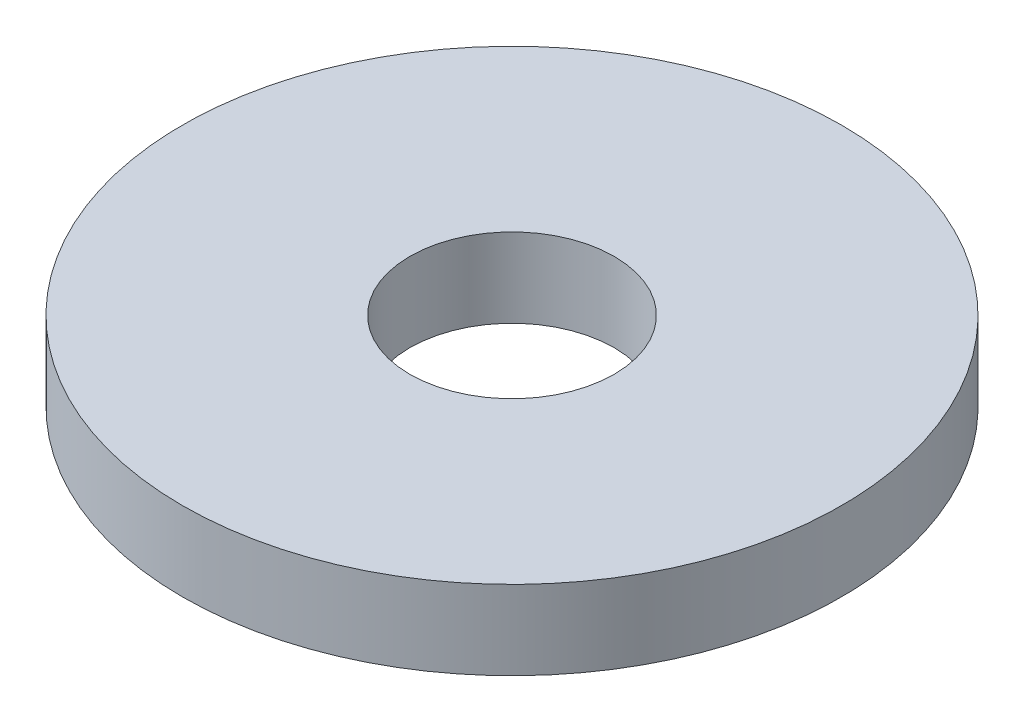
ISO-10303-21;
HEADER;
FILE_DESCRIPTION(('STEP AP214'),'2;1');
FILE_NAME('part.step','',(''),(''),'','','');
FILE_SCHEMA(('AUTOMOTIVE_DESIGN { 1 0 10303 214 1 1 1 1 }'));
ENDSEC;
DATA;
#1=APPLICATION_CONTEXT('core data for automotive mechanical design processes');
#2=APPLICATION_PROTOCOL_DEFINITION('international standard','automotive_design',2000,#1);
#3=PRODUCT_CONTEXT('',#1,'mechanical');
#4=PRODUCT('Part','Part','',(#3));
#5=PRODUCT_RELATED_PRODUCT_CATEGORY('part','',(#4));
#6=PRODUCT_DEFINITION_FORMATION('','',#4);
#7=PRODUCT_DEFINITION_CONTEXT('part definition',#1,'design');
#8=PRODUCT_DEFINITION('design','',#6,#7);
#9=PRODUCT_DEFINITION_SHAPE('','',#8);
#10=(LENGTH_UNIT() NAMED_UNIT(*) SI_UNIT(.MILLI.,.METRE.));
#11=(NAMED_UNIT(*) PLANE_ANGLE_UNIT() SI_UNIT($,.RADIAN.));
#12=(NAMED_UNIT(*) SI_UNIT($,.STERADIAN.) SOLID_ANGLE_UNIT());
#13=UNCERTAINTY_MEASURE_WITH_UNIT(LENGTH_MEASURE(1.E-05),#10,'distance_accuracy_value','');
#14=(GEOMETRIC_REPRESENTATION_CONTEXT(3) GLOBAL_UNCERTAINTY_ASSIGNED_CONTEXT((#13)) GLOBAL_UNIT_ASSIGNED_CONTEXT((#10,
#11,#12)) REPRESENTATION_CONTEXT('',''));
#15=CARTESIAN_POINT('',(0.,0.,0.));
#16=DIRECTION('',(0.,0.,1.));
#17=DIRECTION('',(1.,0.,0.));
#18=AXIS2_PLACEMENT_3D('',#15,#16,#17);
#19=CARTESIAN_POINT('',(0.,1.2,0.));
#20=DIRECTION('',(0.,1.,0.));
#21=DIRECTION('',(0.,0.,1.));
#22=AXIS2_PLACEMENT_3D('',#19,#20,#21);
#23=PLANE('',#22);
#24=CARTESIAN_POINT('',(0.,1.2,0.));
#25=DIRECTION('',(0.,1.,0.));
#26=DIRECTION('',(0.,0.,1.));
#27=AXIS2_PLACEMENT_3D('',#24,#25,#26);
#28=CIRCLE('',#27,5.);
#29=CARTESIAN_POINT('',(0.,1.2,5.));
#30=VERTEX_POINT('',#29);
#31=EDGE_CURVE('E10',#30,#30,#28,.T.);
#32=ORIENTED_EDGE('',*,*,#31,.T.);
#33=EDGE_LOOP('',(#32));
#34=FACE_BOUND('',#33,.T.);
#35=CARTESIAN_POINT('',(0.,1.2,0.));
#36=DIRECTION('',(0.,1.,0.));
#37=DIRECTION('',(0.,0.,1.));
#38=AXIS2_PLACEMENT_3D('',#35,#36,#37);
#39=CIRCLE('',#38,1.55);
#40=CARTESIAN_POINT('',(0.,1.2,1.55));
#41=VERTEX_POINT('',#40);
#42=EDGE_CURVE('E48',#41,#41,#39,.T.);
#43=ORIENTED_EDGE('',*,*,#42,.F.);
#44=EDGE_LOOP('',(#43));
#45=FACE_BOUND('',#44,.T.);
#46=ADVANCED_FACE('F37',(#34,#45),#23,.T.);
#47=CARTESIAN_POINT('',(0.,0.,0.));
#48=DIRECTION('',(0.,1.,0.));
#49=DIRECTION('',(0.,0.,1.));
#50=AXIS2_PLACEMENT_3D('',#47,#48,#49);
#51=PLANE('',#50);
#52=CARTESIAN_POINT('',(0.,0.,0.));
#53=DIRECTION('',(0.,1.,0.));
#54=DIRECTION('',(0.,0.,1.));
#55=AXIS2_PLACEMENT_3D('',#52,#53,#54);
#56=CIRCLE('',#55,5.);
#57=CARTESIAN_POINT('',(0.,0.,5.));
#58=VERTEX_POINT('',#57);
#59=EDGE_CURVE('E41',#58,#58,#56,.T.);
#60=ORIENTED_EDGE('',*,*,#59,.F.);
#61=EDGE_LOOP('',(#60));
#62=FACE_BOUND('',#61,.T.);
#63=CARTESIAN_POINT('',(0.,0.,0.));
#64=DIRECTION('',(0.,1.,0.));
#65=DIRECTION('',(0.,0.,1.));
#66=AXIS2_PLACEMENT_3D('',#63,#64,#65);
#67=CIRCLE('',#66,1.55);
#68=CARTESIAN_POINT('',(0.,0.,1.55));
#69=VERTEX_POINT('',#68);
#70=EDGE_CURVE('E50',#69,#69,#67,.T.);
#71=ORIENTED_EDGE('',*,*,#70,.T.);
#72=EDGE_LOOP('',(#71));
#73=FACE_BOUND('',#72,.T.);
#74=ADVANCED_FACE('F60',(#62,#73),#51,.F.);
#75=CARTESIAN_POINT('',(0.,1.2,0.));
#76=DIRECTION('',(0.,-1.,0.));
#77=DIRECTION('',(0.,0.,-1.));
#78=AXIS2_PLACEMENT_3D('',#75,#76,#77);
#79=CYLINDRICAL_SURFACE('',#78,5.);
#80=ORIENTED_EDGE('',*,*,#31,.F.);
#81=EDGE_LOOP('',(#80));
#82=FACE_BOUND('',#81,.T.);
#83=ORIENTED_EDGE('',*,*,#59,.T.);
#84=EDGE_LOOP('',(#83));
#85=FACE_BOUND('',#84,.T.);
#86=ADVANCED_FACE('F39',(#82,#85),#79,.T.);
#87=CARTESIAN_POINT('',(0.,1.2,0.));
#88=DIRECTION('',(0.,-1.,0.));
#89=DIRECTION('',(0.,0.,-1.));
#90=AXIS2_PLACEMENT_3D('',#87,#88,#89);
#91=CYLINDRICAL_SURFACE('',#90,1.55);
#92=ORIENTED_EDGE('',*,*,#42,.T.);
#93=EDGE_LOOP('',(#92));
#94=FACE_BOUND('',#93,.T.);
#95=ORIENTED_EDGE('',*,*,#70,.F.);
#96=EDGE_LOOP('',(#95));
#97=FACE_BOUND('',#96,.T.);
#98=ADVANCED_FACE('F56',(#94,#97),#91,.F.);
#99=CLOSED_SHELL('',(#46,#74,#86,#98));
#100=MANIFOLD_SOLID_BREP('B2',#99);
#101=ADVANCED_BREP_SHAPE_REPRESENTATION('',(#18,#100),#14);
#102=SHAPE_DEFINITION_REPRESENTATION(#9,#101);
ENDSEC;
END-ISO-10303-21;
